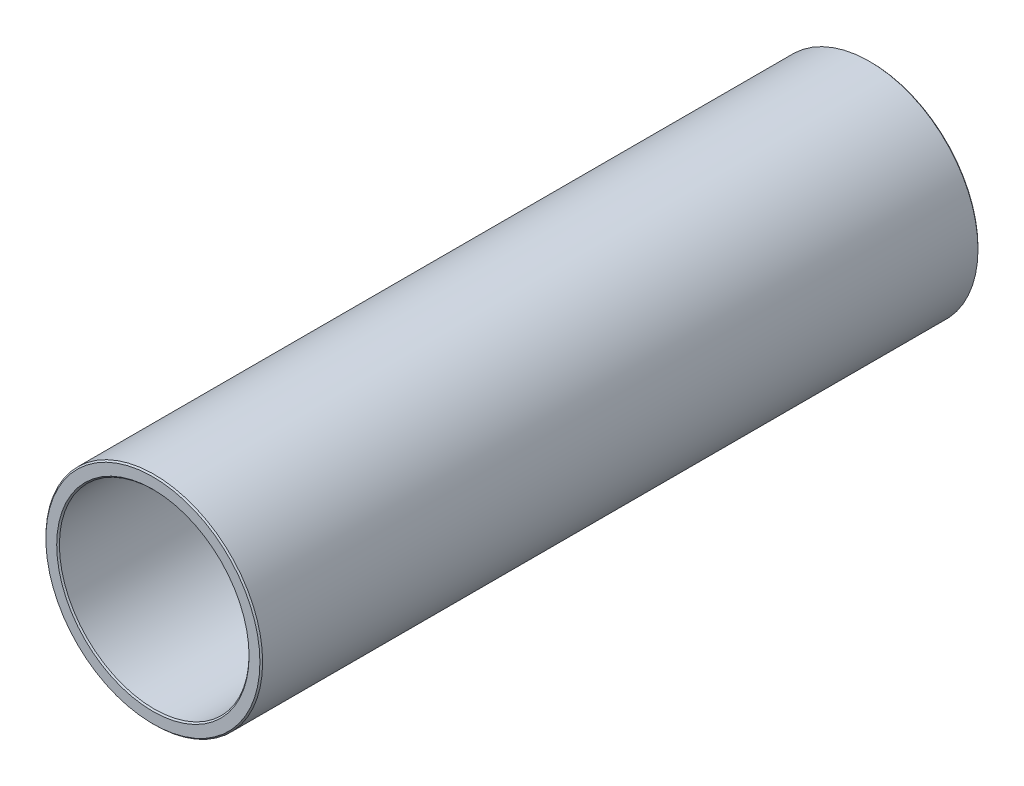
ISO-10303-21;
HEADER;
FILE_DESCRIPTION(('STEP AP214'),'2;1');
FILE_NAME('part.step','',(''),(''),'','','');
FILE_SCHEMA(('AUTOMOTIVE_DESIGN { 1 0 10303 214 1 1 1 1 }'));
ENDSEC;
DATA;
#1=APPLICATION_CONTEXT('core data for automotive mechanical design processes');
#2=APPLICATION_PROTOCOL_DEFINITION('international standard','automotive_design',2000,#1);
#3=PRODUCT_CONTEXT('',#1,'mechanical');
#4=PRODUCT('Part','Part','',(#3));
#5=PRODUCT_RELATED_PRODUCT_CATEGORY('part','',(#4));
#6=PRODUCT_DEFINITION_FORMATION('','',#4);
#7=PRODUCT_DEFINITION_CONTEXT('part definition',#1,'design');
#8=PRODUCT_DEFINITION('design','',#6,#7);
#9=PRODUCT_DEFINITION_SHAPE('','',#8);
#10=(LENGTH_UNIT() NAMED_UNIT(*) SI_UNIT(.MILLI.,.METRE.));
#11=(NAMED_UNIT(*) PLANE_ANGLE_UNIT() SI_UNIT($,.RADIAN.));
#12=(NAMED_UNIT(*) SI_UNIT($,.STERADIAN.) SOLID_ANGLE_UNIT());
#13=UNCERTAINTY_MEASURE_WITH_UNIT(LENGTH_MEASURE(1.E-05),#10,'distance_accuracy_value','');
#14=(GEOMETRIC_REPRESENTATION_CONTEXT(3) GLOBAL_UNCERTAINTY_ASSIGNED_CONTEXT((#13)) GLOBAL_UNIT_ASSIGNED_CONTEXT((#10,
#11,#12)) REPRESENTATION_CONTEXT('',''));
#15=CARTESIAN_POINT('',(0.,0.,0.));
#16=DIRECTION('',(0.,0.,1.));
#17=DIRECTION('',(1.,0.,0.));
#18=AXIS2_PLACEMENT_3D('',#15,#16,#17);
#19=CARTESIAN_POINT('',(0.,0.,53.));
#20=DIRECTION('',(0.,0.,1.));
#21=DIRECTION('',(1.,0.,0.));
#22=AXIS2_PLACEMENT_3D('',#19,#20,#21);
#23=PLANE('',#22);
#24=CARTESIAN_POINT('',(0.,0.,53.));
#25=DIRECTION('',(0.,0.,1.));
#26=DIRECTION('',(1.,0.,0.));
#27=AXIS2_PLACEMENT_3D('',#24,#25,#26);
#28=CIRCLE('',#27,7.09999999999998);
#29=CARTESIAN_POINT('',(7.09999999999998,0.,53.));
#30=VERTEX_POINT('',#29);
#31=EDGE_CURVE('E10',#30,#30,#28,.F.);
#32=ORIENTED_EDGE('',*,*,#31,.T.);
#33=EDGE_LOOP('',(#32));
#34=FACE_BOUND('',#33,.T.);
#35=CARTESIAN_POINT('',(0.,0.,53.));
#36=DIRECTION('',(0.,0.,1.));
#37=DIRECTION('',(1.,0.,0.));
#38=AXIS2_PLACEMENT_3D('',#35,#36,#37);
#39=CIRCLE('',#38,7.9);
#40=CARTESIAN_POINT('',(7.9,0.,53.));
#41=VERTEX_POINT('',#40);
#42=EDGE_CURVE('E43',#41,#41,#39,.T.);
#43=ORIENTED_EDGE('',*,*,#42,.T.);
#44=EDGE_LOOP('',(#43));
#45=FACE_BOUND('',#44,.T.);
#46=ADVANCED_FACE('F35',(#34,#45),#23,.T.);
#47=CARTESIAN_POINT('',(0.,0.,0.));
#48=DIRECTION('',(0.,0.,1.));
#49=DIRECTION('',(1.,0.,0.));
#50=AXIS2_PLACEMENT_3D('',#47,#48,#49);
#51=PLANE('',#50);
#52=CARTESIAN_POINT('',(0.,0.,0.));
#53=DIRECTION('',(0.,0.,1.));
#54=DIRECTION('',(1.,0.,0.));
#55=AXIS2_PLACEMENT_3D('',#52,#53,#54);
#56=CIRCLE('',#55,7.1);
#57=CARTESIAN_POINT('',(-7.1,0.,0.));
#58=VERTEX_POINT('',#57);
#59=EDGE_CURVE('E62',#58,#58,#56,.T.);
#60=ORIENTED_EDGE('',*,*,#59,.T.);
#61=EDGE_LOOP('',(#60));
#62=FACE_BOUND('',#61,.T.);
#63=CARTESIAN_POINT('',(0.,0.,0.));
#64=DIRECTION('',(0.,0.,1.));
#65=DIRECTION('',(1.,0.,0.));
#66=AXIS2_PLACEMENT_3D('',#63,#64,#65);
#67=CIRCLE('',#66,7.9);
#68=CARTESIAN_POINT('',(7.9,0.,0.));
#69=VERTEX_POINT('',#68);
#70=EDGE_CURVE('E65',#69,#69,#67,.F.);
#71=ORIENTED_EDGE('',*,*,#70,.T.);
#72=EDGE_LOOP('',(#71));
#73=FACE_BOUND('',#72,.T.);
#74=ADVANCED_FACE('F69',(#62,#73),#51,.F.);
#75=CARTESIAN_POINT('',(0.,0.,53.));
#76=DIRECTION('',(0.,0.,-1.));
#77=DIRECTION('',(-1.,0.,0.));
#78=AXIS2_PLACEMENT_3D('',#75,#76,#77);
#79=CYLINDRICAL_SURFACE('',#78,8.);
#80=CARTESIAN_POINT('',(0.,0.,0.10000000000001));
#81=DIRECTION('',(0.,0.,1.));
#82=DIRECTION('',(1.,0.,0.));
#83=AXIS2_PLACEMENT_3D('',#80,#81,#82);
#84=CIRCLE('',#83,8.);
#85=CARTESIAN_POINT('',(8.,0.,0.10000000000001));
#86=VERTEX_POINT('',#85);
#87=EDGE_CURVE('E47',#86,#86,#84,.T.);
#88=ORIENTED_EDGE('',*,*,#87,.T.);
#89=EDGE_LOOP('',(#88));
#90=FACE_BOUND('',#89,.T.);
#91=CARTESIAN_POINT('',(0.,0.,52.9));
#92=DIRECTION('',(0.,0.,1.));
#93=DIRECTION('',(1.,0.,0.));
#94=AXIS2_PLACEMENT_3D('',#91,#92,#93);
#95=CIRCLE('',#94,8.);
#96=CARTESIAN_POINT('',(8.,0.,52.9));
#97=VERTEX_POINT('',#96);
#98=EDGE_CURVE('E51',#97,#97,#95,.F.);
#99=ORIENTED_EDGE('',*,*,#98,.T.);
#100=EDGE_LOOP('',(#99));
#101=FACE_BOUND('',#100,.T.);
#102=ADVANCED_FACE('F79',(#90,#101),#79,.T.);
#103=CARTESIAN_POINT('',(0.,0.,53.));
#104=DIRECTION('',(0.,0.,-1.));
#105=DIRECTION('',(-1.,0.,0.));
#106=AXIS2_PLACEMENT_3D('',#103,#104,#105);
#107=CYLINDRICAL_SURFACE('',#106,7.);
#108=CARTESIAN_POINT('',(0.,0.,0.099999999999989));
#109=DIRECTION('',(0.,0.,1.));
#110=DIRECTION('',(1.,0.,0.));
#111=AXIS2_PLACEMENT_3D('',#108,#109,#110);
#112=CIRCLE('',#111,7.);
#113=CARTESIAN_POINT('',(-7.,0.,0.099999999999989));
#114=VERTEX_POINT('',#113);
#115=EDGE_CURVE('E56',#114,#114,#112,.F.);
#116=ORIENTED_EDGE('',*,*,#115,.T.);
#117=EDGE_LOOP('',(#116));
#118=FACE_BOUND('',#117,.T.);
#119=CARTESIAN_POINT('',(0.,0.,52.9));
#120=DIRECTION('',(0.,0.,1.));
#121=DIRECTION('',(1.,0.,0.));
#122=AXIS2_PLACEMENT_3D('',#119,#120,#121);
#123=CIRCLE('',#122,7.);
#124=CARTESIAN_POINT('',(7.,0.,52.9));
#125=VERTEX_POINT('',#124);
#126=EDGE_CURVE('E59',#125,#125,#123,.T.);
#127=ORIENTED_EDGE('',*,*,#126,.T.);
#128=EDGE_LOOP('',(#127));
#129=FACE_BOUND('',#128,.T.);
#130=ADVANCED_FACE('F82',(#118,#129),#107,.F.);
#131=CARTESIAN_POINT('',(0.,0.,0.));
#132=DIRECTION('',(0.,0.,-1.));
#133=DIRECTION('',(-1.,0.,0.));
#134=AXIS2_PLACEMENT_3D('',#131,#132,#133);
#135=CONICAL_SURFACE('',#134,7.1,0.785398163397479);
#136=CARTESIAN_POINT('',(-7.,0.,0.099999999999989));
#137=CARTESIAN_POINT('',(-7.00104166666667,0.,0.0989583333333225));
#138=CARTESIAN_POINT('',(-7.00208333333333,0.,0.0979166666666559));
#139=CARTESIAN_POINT('',(-7.00416666666667,0.,0.0958333333333227));
#140=CARTESIAN_POINT('',(-7.00520833333333,0.,0.0947916666666561));
#141=CARTESIAN_POINT('',(-7.00729166666667,0.,0.0927083333333231));
#142=CARTESIAN_POINT('',(-7.00833333333333,0.,0.0916666666666566));
#143=CARTESIAN_POINT('',(-7.01041666666667,0.,0.0895833333333236));
#144=CARTESIAN_POINT('',(-7.01145833333333,0.,0.0885416666666569));
#145=CARTESIAN_POINT('',(-7.01354166666667,0.,0.0864583333333238));
#146=CARTESIAN_POINT('',(-7.01458333333333,0.,0.0854166666666573));
#147=CARTESIAN_POINT('',(-7.01666666666667,0.,0.0833333333333241));
#148=CARTESIAN_POINT('',(-7.01770833333333,0.,0.0822916666666575));
#149=CARTESIAN_POINT('',(-7.01979166666667,0.,0.0802083333333244));
#150=CARTESIAN_POINT('',(-7.02083333333333,0.,0.079166666666658));
#151=CARTESIAN_POINT('',(-7.02291666666667,0.,0.0770833333333249));
#152=CARTESIAN_POINT('',(-7.02395833333333,0.,0.0760416666666583));
#153=CARTESIAN_POINT('',(-7.02604166666667,0.,0.0739583333333251));
#154=CARTESIAN_POINT('',(-7.02708333333333,0.,0.0729166666666586));
#155=CARTESIAN_POINT('',(-7.02916666666667,0.,0.0708333333333255));
#156=CARTESIAN_POINT('',(-7.03020833333333,0.,0.069791666666659));
#157=CARTESIAN_POINT('',(-7.03229166666666,0.,0.0677083333333258));
#158=CARTESIAN_POINT('',(-7.03333333333333,0.,0.0666666666666592));
#159=CARTESIAN_POINT('',(-7.03541666666666,0.,0.0645833333333262));
#160=CARTESIAN_POINT('',(-7.03645833333333,0.,0.0635416666666597));
#161=CARTESIAN_POINT('',(-7.03854166666667,0.,0.0614583333333266));
#162=CARTESIAN_POINT('',(-7.03958333333333,0.,0.06041666666666));
#163=CARTESIAN_POINT('',(-7.04166666666667,0.,0.0583333333333269));
#164=CARTESIAN_POINT('',(-7.04270833333333,0.,0.0572916666666603));
#165=CARTESIAN_POINT('',(-7.04479166666666,0.,0.0552083333333273));
#166=CARTESIAN_POINT('',(-7.04583333333333,0.,0.0541666666666607));
#167=CARTESIAN_POINT('',(-7.04791666666666,0.,0.0520833333333276));
#168=CARTESIAN_POINT('',(-7.04895833333333,0.,0.0510416666666609));
#169=CARTESIAN_POINT('',(-7.05104166666666,0.,0.0489583333333279));
#170=CARTESIAN_POINT('',(-7.05208333333333,0.,0.0479166666666614));
#171=CARTESIAN_POINT('',(-7.05416666666666,0.,0.0458333333333284));
#172=CARTESIAN_POINT('',(-7.05520833333333,0.,0.0447916666666617));
#173=CARTESIAN_POINT('',(-7.05729166666666,0.,0.0427083333333286));
#174=CARTESIAN_POINT('',(-7.05833333333333,0.,0.0416666666666621));
#175=CARTESIAN_POINT('',(-7.06041666666666,0.,0.0395833333333289));
#176=CARTESIAN_POINT('',(-7.06145833333333,0.,0.0385416666666623));
#177=CARTESIAN_POINT('',(-7.06354166666666,0.,0.0364583333333293));
#178=CARTESIAN_POINT('',(-7.06458333333333,0.,0.0354166666666628));
#179=CARTESIAN_POINT('',(-7.06666666666666,0.,0.0333333333333298));
#180=CARTESIAN_POINT('',(-7.06770833333333,0.,0.0322916666666631));
#181=CARTESIAN_POINT('',(-7.06979166666666,0.,0.03020833333333));
#182=CARTESIAN_POINT('',(-7.07083333333333,0.,0.0291666666666634));
#183=CARTESIAN_POINT('',(-7.07291666666666,0.,0.0270833333333304));
#184=CARTESIAN_POINT('',(-7.07395833333333,0.,0.0260416666666638));
#185=CARTESIAN_POINT('',(-7.07604166666666,0.,0.0239583333333307));
#186=CARTESIAN_POINT('',(-7.07708333333333,0.,0.022916666666664));
#187=CARTESIAN_POINT('',(-7.07916666666666,0.,0.020833333333331));
#188=CARTESIAN_POINT('',(-7.08020833333333,0.,0.0197916666666645));
#189=CARTESIAN_POINT('',(-7.08229166666666,0.,0.0177083333333315));
#190=CARTESIAN_POINT('',(-7.08333333333333,0.,0.0166666666666648));
#191=CARTESIAN_POINT('',(-7.08541666666666,0.,0.0145833333333317));
#192=CARTESIAN_POINT('',(-7.08645833333333,0.,0.0135416666666652));
#193=CARTESIAN_POINT('',(-7.08854166666666,0.,0.0114583333333321));
#194=CARTESIAN_POINT('',(-7.08958333333333,0.,0.0104166666666654));
#195=CARTESIAN_POINT('',(-7.09166666666666,0.,0.00833333333333236));
#196=CARTESIAN_POINT('',(-7.09270833333333,0.,0.00729166666666591));
#197=CARTESIAN_POINT('',(-7.09479166666666,0.,0.00520833333333286));
#198=CARTESIAN_POINT('',(-7.09583333333333,0.,0.00416666666666626));
#199=CARTESIAN_POINT('',(-7.09791666666666,0.,0.00208333333333305));
#200=CARTESIAN_POINT('',(-7.09895833333333,0.,0.00104166666666645));
#201=CARTESIAN_POINT('',(-7.1,0.,0.));
#202=B_SPLINE_CURVE_WITH_KNOTS('',3,(#136,#137,#138,#139,#140,#141,#142,#143,#144,#145,#146,
#147,#148,#149,#150,#151,#152,#153,#154,#155,#156,#157,#158,#159,#160,#161,#162,#163,#164,#165,
#166,#167,#168,#169,#170,#171,#172,#173,#174,#175,#176,#177,#178,#179,#180,#181,#182,#183,#184,
#185,#186,#187,#188,#189,#190,#191,#192,#193,#194,#195,#196,#197,#198,#199,#200,#201),
.UNSPECIFIED.,.F.,.F.,(4,2,2,2,2,2,2,2,2,2,2,2,2,2,2,2,2,2,2,2,2,2,2,2,2,2,2,2,2,2,2,2,4),(0.,
0.00441941738241544,0.00883883476483087,0.0132582521472469,0.0176776695296624,
0.0220970869120778,0.0265165042944932,0.0309359216769093,0.0353553390593247,0.0397747564417401,
0.0441941738241556,0.048613591206571,0.0530330085889871,0.0574524259714025,0.0618718433538179,
0.0662912607362334,0.0707106781186488,0.0751300955010649,0.0795495128834803,0.0839689302658957,
0.0883883476483112,0.0928077650307272,0.0972271824131427,0.101646599795558,0.106066017177974,
0.110485434560389,0.114904851942805,0.11932426932522,0.123743686707636,0.128163104090051,
0.132582521472467,0.137001938854883,0.141421356237298),.UNSPECIFIED.);
#203=EDGE_CURVE('BSEAM75',#114,#58,#202,.T.);
#204=ORIENTED_EDGE('',*,*,#115,.F.);
#205=ORIENTED_EDGE('',*,*,#59,.F.);
#206=ORIENTED_EDGE('',*,*,#203,.T.);
#207=ORIENTED_EDGE('',*,*,#203,.F.);
#208=EDGE_LOOP('',(#204,#206,#205,#207));
#209=FACE_BOUND('',#208,.T.);
#210=ADVANCED_FACE('F75',(#209),#135,.F.);
#211=CARTESIAN_POINT('',(0.,0.,0.10000000000001));
#212=DIRECTION('',(0.,0.,1.));
#213=DIRECTION('',(1.,0.,0.));
#214=AXIS2_PLACEMENT_3D('',#211,#212,#213);
#215=CONICAL_SURFACE('',#214,8.,0.785398163397414);
#216=ORIENTED_EDGE('',*,*,#70,.F.);
#217=EDGE_LOOP('',(#216));
#218=FACE_BOUND('',#217,.T.);
#219=ORIENTED_EDGE('',*,*,#87,.F.);
#220=EDGE_LOOP('',(#219));
#221=FACE_BOUND('',#220,.T.);
#222=ADVANCED_FACE('F71',(#218,#221),#215,.T.);
#223=CARTESIAN_POINT('',(0.,0.,52.9));
#224=DIRECTION('',(0.,0.,1.));
#225=DIRECTION('',(1.,0.,0.));
#226=AXIS2_PLACEMENT_3D('',#223,#224,#225);
#227=CONICAL_SURFACE('',#226,7.,0.785398163397444);
#228=ORIENTED_EDGE('',*,*,#31,.F.);
#229=EDGE_LOOP('',(#228));
#230=FACE_BOUND('',#229,.T.);
#231=ORIENTED_EDGE('',*,*,#126,.F.);
#232=EDGE_LOOP('',(#231));
#233=FACE_BOUND('',#232,.T.);
#234=ADVANCED_FACE('F74',(#230,#233),#227,.F.);
#235=CARTESIAN_POINT('',(0.,0.,53.));
#236=DIRECTION('',(0.,0.,-1.));
#237=DIRECTION('',(-1.,0.,0.));
#238=AXIS2_PLACEMENT_3D('',#235,#236,#237);
#239=CONICAL_SURFACE('',#238,7.9,0.785398163397448);
#240=ORIENTED_EDGE('',*,*,#98,.F.);
#241=EDGE_LOOP('',(#240));
#242=FACE_BOUND('',#241,.T.);
#243=ORIENTED_EDGE('',*,*,#42,.F.);
#244=EDGE_LOOP('',(#243));
#245=FACE_BOUND('',#244,.T.);
#246=ADVANCED_FACE('F38',(#242,#245),#239,.T.);
#247=CLOSED_SHELL('',(#46,#74,#102,#130,#210,#222,#234,#246));
#248=MANIFOLD_SOLID_BREP('B2',#247);
#249=ADVANCED_BREP_SHAPE_REPRESENTATION('',(#18,#248),#14);
#250=SHAPE_DEFINITION_REPRESENTATION(#9,#249);
ENDSEC;
END-ISO-10303-21;
